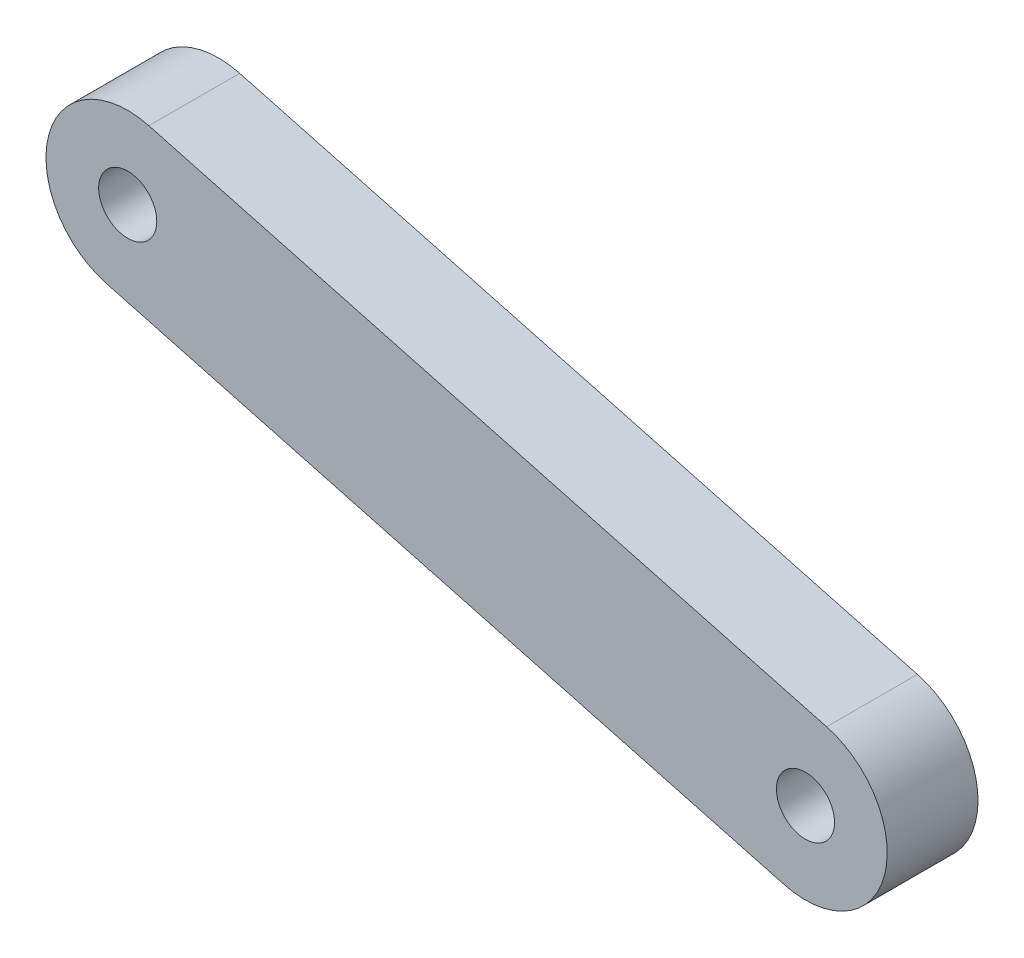
ISO-10303-21;
HEADER;
FILE_DESCRIPTION(('STEP AP214'),'2;1');
FILE_NAME('part.step','',(''),(''),'','','');
FILE_SCHEMA(('AUTOMOTIVE_DESIGN { 1 0 10303 214 1 1 1 1 }'));
ENDSEC;
DATA;
#1=APPLICATION_CONTEXT('core data for automotive mechanical design processes');
#2=APPLICATION_PROTOCOL_DEFINITION('international standard','automotive_design',2000,#1);
#3=PRODUCT_CONTEXT('',#1,'mechanical');
#4=PRODUCT('Part','Part','',(#3));
#5=PRODUCT_RELATED_PRODUCT_CATEGORY('part','',(#4));
#6=PRODUCT_DEFINITION_FORMATION('','',#4);
#7=PRODUCT_DEFINITION_CONTEXT('part definition',#1,'design');
#8=PRODUCT_DEFINITION('design','',#6,#7);
#9=PRODUCT_DEFINITION_SHAPE('','',#8);
#10=(LENGTH_UNIT() NAMED_UNIT(*) SI_UNIT(.MILLI.,.METRE.));
#11=(NAMED_UNIT(*) PLANE_ANGLE_UNIT() SI_UNIT($,.RADIAN.));
#12=(NAMED_UNIT(*) SI_UNIT($,.STERADIAN.) SOLID_ANGLE_UNIT());
#13=UNCERTAINTY_MEASURE_WITH_UNIT(LENGTH_MEASURE(1.E-05),#10,'distance_accuracy_value','');
#14=(GEOMETRIC_REPRESENTATION_CONTEXT(3) GLOBAL_UNCERTAINTY_ASSIGNED_CONTEXT((#13)) GLOBAL_UNIT_ASSIGNED_CONTEXT((#10,
#11,#12)) REPRESENTATION_CONTEXT('',''));
#15=CARTESIAN_POINT('',(0.,0.,0.));
#16=DIRECTION('',(0.,0.,1.));
#17=DIRECTION('',(1.,0.,0.));
#18=AXIS2_PLACEMENT_3D('',#15,#16,#17);
#19=CARTESIAN_POINT('',(-17.38805970149,45.970149253731,5.5));
#20=DIRECTION('',(0.,0.,1.));
#21=DIRECTION('',(1.,0.,0.));
#22=AXIS2_PLACEMENT_3D('',#19,#20,#21);
#23=CYLINDRICAL_SURFACE('',#22,1.6);
#24=DIRECTION('',(0.,0.,1.));
#25=VECTOR('',#24,1.);
#26=CARTESIAN_POINT('',(-15.78805970149,45.970149253731,5.5));
#27=LINE('',#26,#25);
#28=CARTESIAN_POINT('',(-15.78805970149,45.970149253731,13.));
#29=VERTEX_POINT('',#28);
#30=CARTESIAN_POINT('',(-15.78805970149,45.970149253731,18.));
#31=VERTEX_POINT('',#30);
#32=EDGE_CURVE('E10',#29,#31,#27,.T.);
#33=ORIENTED_EDGE('',*,*,#32,.F.);
#34=CARTESIAN_POINT('',(-17.38805970149,45.970149253731,13.));
#35=DIRECTION('',(0.,0.,1.));
#36=DIRECTION('',(1.,0.,0.));
#37=AXIS2_PLACEMENT_3D('',#34,#35,#36);
#38=CIRCLE('',#37,1.6);
#39=EDGE_CURVE('E125',#29,#29,#38,.T.);
#40=ORIENTED_EDGE('',*,*,#39,.F.);
#41=ORIENTED_EDGE('',*,*,#32,.T.);
#42=CARTESIAN_POINT('',(-17.38805970149,45.970149253731,18.));
#43=DIRECTION('',(0.,0.,1.));
#44=DIRECTION('',(1.,0.,0.));
#45=AXIS2_PLACEMENT_3D('',#42,#43,#44);
#46=CIRCLE('',#45,1.6);
#47=EDGE_CURVE('E151',#31,#31,#46,.T.);
#48=ORIENTED_EDGE('',*,*,#47,.T.);
#49=EDGE_LOOP('',(#33,#40,#41,#48));
#50=FACE_BOUND('',#49,.T.);
#51=ADVANCED_FACE('F16',(#50),#23,.F.);
#52=CARTESIAN_POINT('',(-54.70149253731,55.970149253731,5.5));
#53=DIRECTION('',(0.,0.,1.));
#54=DIRECTION('',(1.,0.,0.));
#55=AXIS2_PLACEMENT_3D('',#52,#53,#54);
#56=CYLINDRICAL_SURFACE('',#55,1.6);
#57=DIRECTION('',(0.,0.,1.));
#58=VECTOR('',#57,1.);
#59=CARTESIAN_POINT('',(-53.10149253731,55.970149253731,5.5));
#60=LINE('',#59,#58);
#61=CARTESIAN_POINT('',(-53.10149253731,55.970149253731,13.));
#62=VERTEX_POINT('',#61);
#63=CARTESIAN_POINT('',(-53.10149253731,55.970149253731,18.));
#64=VERTEX_POINT('',#63);
#65=EDGE_CURVE('E27',#62,#64,#60,.T.);
#66=ORIENTED_EDGE('',*,*,#65,.F.);
#67=CARTESIAN_POINT('',(-54.70149253731,55.970149253731,13.));
#68=DIRECTION('',(0.,0.,1.));
#69=DIRECTION('',(1.,0.,0.));
#70=AXIS2_PLACEMENT_3D('',#67,#68,#69);
#71=CIRCLE('',#70,1.6);
#72=EDGE_CURVE('E128',#62,#62,#71,.T.);
#73=ORIENTED_EDGE('',*,*,#72,.F.);
#74=ORIENTED_EDGE('',*,*,#65,.T.);
#75=CARTESIAN_POINT('',(-54.70149253731,55.970149253731,18.));
#76=DIRECTION('',(0.,0.,1.));
#77=DIRECTION('',(1.,0.,0.));
#78=AXIS2_PLACEMENT_3D('',#75,#76,#77);
#79=CIRCLE('',#78,1.6);
#80=EDGE_CURVE('E123',#64,#64,#79,.T.);
#81=ORIENTED_EDGE('',*,*,#80,.T.);
#82=EDGE_LOOP('',(#66,#73,#74,#81));
#83=FACE_BOUND('',#82,.T.);
#84=ADVANCED_FACE('F18',(#83),#56,.F.);
#85=CARTESIAN_POINT('',(-17.38805970149,45.970149253731,13.));
#86=DIRECTION('',(0.,0.,-1.));
#87=DIRECTION('',(-0.965913556274029,0.258864833081008,0.));
#88=AXIS2_PLACEMENT_3D('',#85,#86,#87);
#89=CYLINDRICAL_SURFACE('',#88,4.5);
#90=DIRECTION('',(0.,0.,1.));
#91=VECTOR('',#90,1.);
#92=CARTESIAN_POINT('',(-16.22316795262,50.316760256964,13.));
#93=LINE('',#92,#91);
#94=CARTESIAN_POINT('',(-16.22316795262,50.316760256964,13.));
#95=VERTEX_POINT('',#94);
#96=CARTESIAN_POINT('',(-16.22316795262,50.316760256964,18.));
#97=VERTEX_POINT('',#96);
#98=EDGE_CURVE('E130',#95,#97,#93,.T.);
#99=ORIENTED_EDGE('',*,*,#98,.T.);
#100=CARTESIAN_POINT('',(-17.38805970149,45.970149253731,18.));
#101=DIRECTION('',(0.,0.,-1.));
#102=DIRECTION('',(-0.965913556274029,0.258864833081008,0.));
#103=AXIS2_PLACEMENT_3D('',#100,#101,#102);
#104=CIRCLE('',#103,4.5);
#105=CARTESIAN_POINT('',(-18.55295145035,41.623538250499,18.));
#106=VERTEX_POINT('',#105);
#107=EDGE_CURVE('E127',#97,#106,#104,.T.);
#108=ORIENTED_EDGE('',*,*,#107,.T.);
#109=DIRECTION('',(0.,0.,1.));
#110=VECTOR('',#109,1.);
#111=CARTESIAN_POINT('',(-18.55295145035,41.623538250499,13.));
#112=LINE('',#111,#110);
#113=CARTESIAN_POINT('',(-18.55295145035,41.623538250499,13.));
#114=VERTEX_POINT('',#113);
#115=EDGE_CURVE('E104',#114,#106,#112,.T.);
#116=ORIENTED_EDGE('',*,*,#115,.F.);
#117=CARTESIAN_POINT('',(-17.38805970149,45.970149253731,13.));
#118=DIRECTION('',(0.,0.,-1.));
#119=DIRECTION('',(-0.965913556274029,0.258864833081008,0.));
#120=AXIS2_PLACEMENT_3D('',#117,#118,#119);
#121=CIRCLE('',#120,4.5);
#122=EDGE_CURVE('E88',#95,#114,#121,.T.);
#123=ORIENTED_EDGE('',*,*,#122,.F.);
#124=EDGE_LOOP('',(#99,#108,#116,#123));
#125=FACE_BOUND('',#124,.T.);
#126=ADVANCED_FACE('F171',(#125),#89,.T.);
#127=CARTESIAN_POINT('',(-36.0447761194,50.970149253731,18.));
#128=DIRECTION('',(0.,0.,1.));
#129=DIRECTION('',(1.,0.,0.));
#130=AXIS2_PLACEMENT_3D('',#127,#128,#129);
#131=PLANE('',#130);
#132=ORIENTED_EDGE('',*,*,#47,.F.);
#133=EDGE_LOOP('',(#132));
#134=FACE_BOUND('',#133,.T.);
#135=ORIENTED_EDGE('',*,*,#80,.F.);
#136=EDGE_LOOP('',(#135));
#137=FACE_BOUND('',#136,.T.);
#138=CARTESIAN_POINT('',(-54.70149253731,55.970149253731,18.));
#139=DIRECTION('',(0.,0.,-1.));
#140=DIRECTION('',(0.965913556274029,-0.258864833081008,0.));
#141=AXIS2_PLACEMENT_3D('',#138,#139,#140);
#142=CIRCLE('',#141,4.5);
#143=CARTESIAN_POINT('',(-55.86638428618,51.623538250499,18.));
#144=VERTEX_POINT('',#143);
#145=CARTESIAN_POINT('',(-53.53660078844,60.316760256964,18.));
#146=VERTEX_POINT('',#145);
#147=EDGE_CURVE('E110',#144,#146,#142,.T.);
#148=ORIENTED_EDGE('',*,*,#147,.F.);
#149=DIRECTION('',(-0.965913556274029,0.258864833081008,0.));
#150=VECTOR('',#149,1.);
#151=CARTESIAN_POINT('',(-18.55295145035,41.623538250499,18.));
#152=LINE('',#151,#150);
#153=EDGE_CURVE('E95',#106,#144,#152,.T.);
#154=ORIENTED_EDGE('',*,*,#153,.F.);
#155=ORIENTED_EDGE('',*,*,#107,.F.);
#156=DIRECTION('',(0.965913556274029,-0.258864833081008,0.));
#157=VECTOR('',#156,1.);
#158=CARTESIAN_POINT('',(-53.53660078844,60.316760256964,18.));
#159=LINE('',#158,#157);
#160=EDGE_CURVE('E94',#146,#97,#159,.T.);
#161=ORIENTED_EDGE('',*,*,#160,.F.);
#162=EDGE_LOOP('',(#148,#154,#155,#161));
#163=FACE_BOUND('',#162,.T.);
#164=ADVANCED_FACE('F168',(#134,#137,#163),#131,.T.);
#165=CARTESIAN_POINT('',(-36.0447761194,50.970149253731,13.));
#166=DIRECTION('',(0.,0.,1.));
#167=DIRECTION('',(1.,0.,0.));
#168=AXIS2_PLACEMENT_3D('',#165,#166,#167);
#169=PLANE('',#168);
#170=ORIENTED_EDGE('',*,*,#39,.T.);
#171=EDGE_LOOP('',(#170));
#172=FACE_BOUND('',#171,.T.);
#173=ORIENTED_EDGE('',*,*,#72,.T.);
#174=EDGE_LOOP('',(#173));
#175=FACE_BOUND('',#174,.T.);
#176=DIRECTION('',(-0.965913556274029,0.258864833081008,0.));
#177=VECTOR('',#176,1.);
#178=CARTESIAN_POINT('',(-16.22316795262,50.316760256964,13.));
#179=LINE('',#178,#177);
#180=CARTESIAN_POINT('',(-53.53660078844,60.316760256964,13.));
#181=VERTEX_POINT('',#180);
#182=EDGE_CURVE('E129',#95,#181,#179,.T.);
#183=ORIENTED_EDGE('',*,*,#182,.F.);
#184=ORIENTED_EDGE('',*,*,#122,.T.);
#185=DIRECTION('',(0.965913556274029,-0.258864833081008,0.));
#186=VECTOR('',#185,1.);
#187=CARTESIAN_POINT('',(-55.86638428618,51.623538250499,13.));
#188=LINE('',#187,#186);
#189=CARTESIAN_POINT('',(-55.86638428618,51.623538250499,13.));
#190=VERTEX_POINT('',#189);
#191=EDGE_CURVE('E82',#190,#114,#188,.T.);
#192=ORIENTED_EDGE('',*,*,#191,.F.);
#193=CARTESIAN_POINT('',(-54.70149253731,55.970149253731,13.));
#194=DIRECTION('',(0.,0.,-1.));
#195=DIRECTION('',(0.965913556274029,-0.258864833081008,0.));
#196=AXIS2_PLACEMENT_3D('',#193,#194,#195);
#197=CIRCLE('',#196,4.5);
#198=EDGE_CURVE('E86',#190,#181,#197,.T.);
#199=ORIENTED_EDGE('',*,*,#198,.T.);
#200=EDGE_LOOP('',(#183,#184,#192,#199));
#201=FACE_BOUND('',#200,.T.);
#202=ADVANCED_FACE('F85',(#172,#175,#201),#169,.F.);
#203=CARTESIAN_POINT('',(-34.87988437053,55.316760256964,13.));
#204=DIRECTION('',(-0.258864833081008,-0.965913556274029,0.));
#205=DIRECTION('',(-0.965913556274029,0.258864833081008,0.));
#206=AXIS2_PLACEMENT_3D('',#203,#204,#205);
#207=PLANE('',#206);
#208=ORIENTED_EDGE('',*,*,#160,.T.);
#209=ORIENTED_EDGE('',*,*,#98,.F.);
#210=ORIENTED_EDGE('',*,*,#182,.T.);
#211=DIRECTION('',(0.,0.,1.));
#212=VECTOR('',#211,1.);
#213=CARTESIAN_POINT('',(-53.53660078844,60.316760256964,13.));
#214=LINE('',#213,#212);
#215=EDGE_CURVE('E102',#181,#146,#214,.T.);
#216=ORIENTED_EDGE('',*,*,#215,.T.);
#217=EDGE_LOOP('',(#208,#209,#210,#216));
#218=FACE_BOUND('',#217,.T.);
#219=ADVANCED_FACE('F174',(#218),#207,.F.);
#220=CARTESIAN_POINT('',(-18.55295145035,41.623538250499,13.));
#221=DIRECTION('',(-0.258864833081008,-0.965913556274029,0.));
#222=DIRECTION('',(-0.965913556274029,0.258864833081008,0.));
#223=AXIS2_PLACEMENT_3D('',#220,#221,#222);
#224=PLANE('',#223);
#225=ORIENTED_EDGE('',*,*,#115,.T.);
#226=ORIENTED_EDGE('',*,*,#153,.T.);
#227=DIRECTION('',(0.,0.,1.));
#228=VECTOR('',#227,1.);
#229=CARTESIAN_POINT('',(-55.86638428618,51.623538250499,13.));
#230=LINE('',#229,#228);
#231=EDGE_CURVE('E20',#190,#144,#230,.T.);
#232=ORIENTED_EDGE('',*,*,#231,.F.);
#233=ORIENTED_EDGE('',*,*,#191,.T.);
#234=EDGE_LOOP('',(#225,#226,#232,#233));
#235=FACE_BOUND('',#234,.T.);
#236=ADVANCED_FACE('F106',(#235),#224,.T.);
#237=CARTESIAN_POINT('',(-54.70149253731,55.970149253731,13.));
#238=DIRECTION('',(0.,0.,-1.));
#239=DIRECTION('',(0.965913556274029,-0.258864833081008,0.));
#240=AXIS2_PLACEMENT_3D('',#237,#238,#239);
#241=CYLINDRICAL_SURFACE('',#240,4.5);
#242=ORIENTED_EDGE('',*,*,#231,.T.);
#243=ORIENTED_EDGE('',*,*,#147,.T.);
#244=ORIENTED_EDGE('',*,*,#215,.F.);
#245=ORIENTED_EDGE('',*,*,#198,.F.);
#246=EDGE_LOOP('',(#242,#243,#244,#245));
#247=FACE_BOUND('',#246,.T.);
#248=ADVANCED_FACE('F99',(#247),#241,.T.);
#249=CLOSED_SHELL('',(#51,#84,#126,#164,#202,#219,#236,#248));
#250=MANIFOLD_SOLID_BREP('B1',#249);
#251=ADVANCED_BREP_SHAPE_REPRESENTATION('',(#18,#250),#14);
#252=SHAPE_DEFINITION_REPRESENTATION(#9,#251);
ENDSEC;
END-ISO-10303-21;
